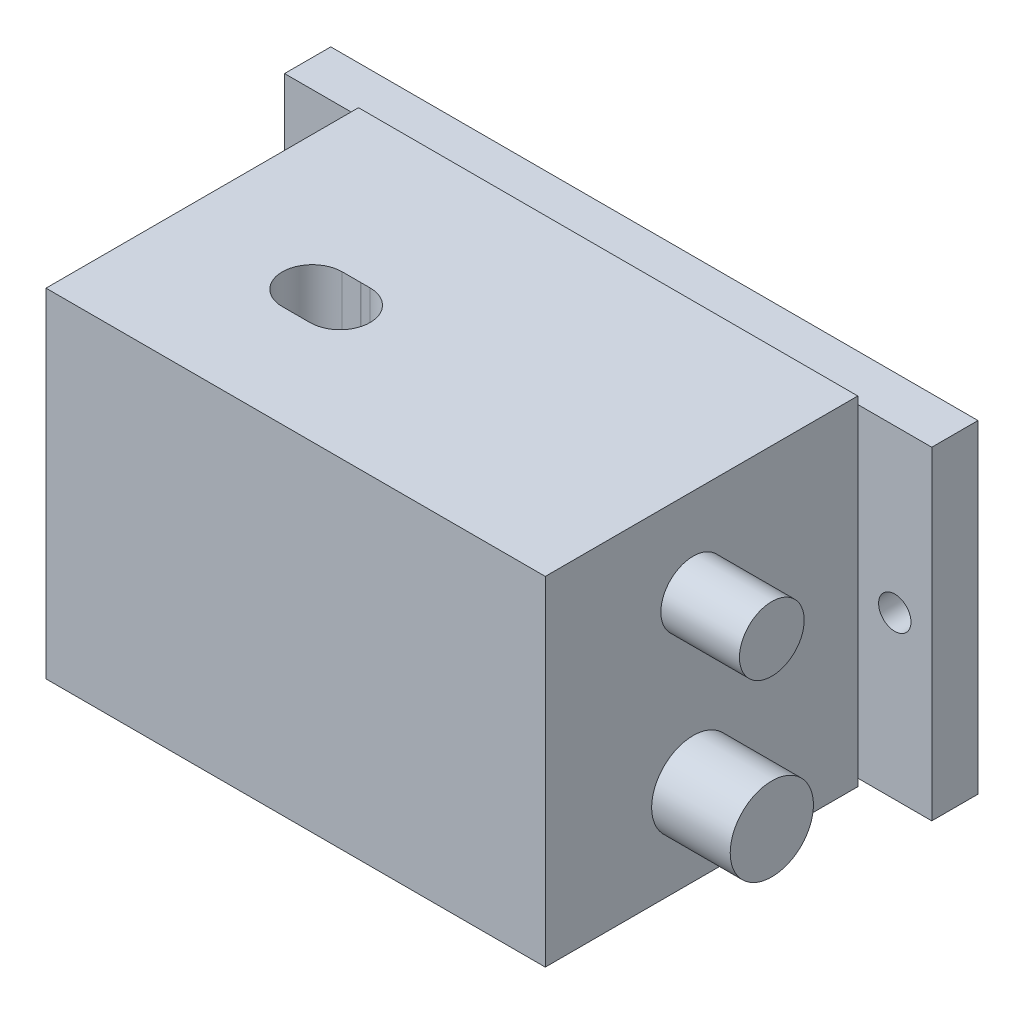
ISO-10303-21;
HEADER;
FILE_DESCRIPTION(('STEP AP214'),'2;1');
FILE_NAME('part.step','',(''),(''),'','','');
FILE_SCHEMA(('AUTOMOTIVE_DESIGN { 1 0 10303 214 1 1 1 1 }'));
ENDSEC;
DATA;
#1=APPLICATION_CONTEXT('core data for automotive mechanical design processes');
#2=APPLICATION_PROTOCOL_DEFINITION('international standard','automotive_design',2000,#1);
#3=PRODUCT_CONTEXT('',#1,'mechanical');
#4=PRODUCT('Part','Part','',(#3));
#5=PRODUCT_RELATED_PRODUCT_CATEGORY('part','',(#4));
#6=PRODUCT_DEFINITION_FORMATION('','',#4);
#7=PRODUCT_DEFINITION_CONTEXT('part definition',#1,'design');
#8=PRODUCT_DEFINITION('design','',#6,#7);
#9=PRODUCT_DEFINITION_SHAPE('','',#8);
#10=(LENGTH_UNIT() NAMED_UNIT(*) SI_UNIT(.MILLI.,.METRE.));
#11=(NAMED_UNIT(*) PLANE_ANGLE_UNIT() SI_UNIT($,.RADIAN.));
#12=(NAMED_UNIT(*) SI_UNIT($,.STERADIAN.) SOLID_ANGLE_UNIT());
#13=UNCERTAINTY_MEASURE_WITH_UNIT(LENGTH_MEASURE(1.E-05),#10,'distance_accuracy_value','');
#14=(GEOMETRIC_REPRESENTATION_CONTEXT(3) GLOBAL_UNCERTAINTY_ASSIGNED_CONTEXT((#13)) GLOBAL_UNIT_ASSIGNED_CONTEXT((#10,
#11,#12)) REPRESENTATION_CONTEXT('',''));
#15=CARTESIAN_POINT('',(0.,0.,0.));
#16=DIRECTION('',(0.,0.,1.));
#17=DIRECTION('',(1.,0.,0.));
#18=AXIS2_PLACEMENT_3D('',#15,#16,#17);
#19=CARTESIAN_POINT('',(27.,8.7,22.8));
#20=DIRECTION('',(1.,0.,0.));
#21=DIRECTION('',(0.,1.,0.));
#22=AXIS2_PLACEMENT_3D('',#19,#20,#21);
#23=CYLINDRICAL_SURFACE('',#22,3.5);
#24=CARTESIAN_POINT('',(35.5,8.7,22.8));
#25=DIRECTION('',(-1.,0.,0.));
#26=DIRECTION('',(0.,0.,1.));
#27=AXIS2_PLACEMENT_3D('',#24,#25,#26);
#28=CIRCLE('',#27,3.5);
#29=CARTESIAN_POINT('',(35.5,8.7,26.3));
#30=VERTEX_POINT('',#29);
#31=EDGE_CURVE('E10',#30,#30,#28,.T.);
#32=ORIENTED_EDGE('',*,*,#31,.T.);
#33=EDGE_LOOP('',(#32));
#34=FACE_BOUND('',#33,.T.);
#35=CARTESIAN_POINT('',(27.,8.7,22.8));
#36=DIRECTION('',(-1.,0.,0.));
#37=DIRECTION('',(0.,0.,1.));
#38=AXIS2_PLACEMENT_3D('',#35,#36,#37);
#39=CIRCLE('',#38,3.5);
#40=CARTESIAN_POINT('',(27.,8.7,26.3));
#41=VERTEX_POINT('',#40);
#42=EDGE_CURVE('E329',#41,#41,#39,.T.);
#43=ORIENTED_EDGE('',*,*,#42,.F.);
#44=EDGE_LOOP('',(#43));
#45=FACE_BOUND('',#44,.T.);
#46=ADVANCED_FACE('F16',(#34,#45),#23,.T.);
#47=CARTESIAN_POINT('',(35.5,8.7,22.4818181818182));
#48=DIRECTION('',(1.,0.,0.));
#49=DIRECTION('',(0.,1.,0.));
#50=AXIS2_PLACEMENT_3D('',#47,#48,#49);
#51=PLANE('',#50);
#52=ORIENTED_EDGE('',*,*,#31,.F.);
#53=EDGE_LOOP('',(#52));
#54=FACE_BOUND('',#53,.T.);
#55=ADVANCED_FACE('F214',(#54),#51,.T.);
#56=CARTESIAN_POINT('',(27.,-9.1,22.8));
#57=DIRECTION('',(1.,0.,0.));
#58=DIRECTION('',(0.,1.,0.));
#59=AXIS2_PLACEMENT_3D('',#56,#57,#58);
#60=CYLINDRICAL_SURFACE('',#59,4.5);
#61=CARTESIAN_POINT('',(35.5,-9.1,22.8));
#62=DIRECTION('',(-1.,0.,0.));
#63=DIRECTION('',(0.,0.,1.));
#64=AXIS2_PLACEMENT_3D('',#61,#62,#63);
#65=CIRCLE('',#64,4.5);
#66=CARTESIAN_POINT('',(35.5,-9.1,27.3));
#67=VERTEX_POINT('',#66);
#68=EDGE_CURVE('E26',#67,#67,#65,.T.);
#69=ORIENTED_EDGE('',*,*,#68,.T.);
#70=EDGE_LOOP('',(#69));
#71=FACE_BOUND('',#70,.T.);
#72=CARTESIAN_POINT('',(27.,-9.1,22.8));
#73=DIRECTION('',(-1.,0.,0.));
#74=DIRECTION('',(0.,0.,1.));
#75=AXIS2_PLACEMENT_3D('',#72,#73,#74);
#76=CIRCLE('',#75,4.5);
#77=CARTESIAN_POINT('',(27.,-9.1,27.3));
#78=VERTEX_POINT('',#77);
#79=EDGE_CURVE('E332',#78,#78,#76,.T.);
#80=ORIENTED_EDGE('',*,*,#79,.F.);
#81=EDGE_LOOP('',(#80));
#82=FACE_BOUND('',#81,.T.);
#83=ADVANCED_FACE('F220',(#71,#82),#60,.T.);
#84=CARTESIAN_POINT('',(35.5,-9.1,22.3909090909091));
#85=DIRECTION('',(1.,0.,0.));
#86=DIRECTION('',(0.,0.,-1.));
#87=AXIS2_PLACEMENT_3D('',#84,#85,#86);
#88=PLANE('',#87);
#89=ORIENTED_EDGE('',*,*,#68,.F.);
#90=EDGE_LOOP('',(#89));
#91=FACE_BOUND('',#90,.T.);
#92=ADVANCED_FACE('F550',(#91),#88,.T.);
#93=CARTESIAN_POINT('',(-11.0000000000244,8.3,24.5000085617076));
#94=DIRECTION('',(0.,1.,0.));
#95=DIRECTION('',(0.,0.,1.));
#96=AXIS2_PLACEMENT_3D('',#93,#94,#95);
#97=PLANE('',#96);
#98=CARTESIAN_POINT('',(-10.5,8.3,24.5));
#99=DIRECTION('',(0.,1.,0.));
#100=DIRECTION('',(1.,0.,0.));
#101=AXIS2_PLACEMENT_3D('',#98,#99,#100);
#102=CIRCLE('',#101,3.25);
#103=CARTESIAN_POINT('',(-10.5,8.3,27.75));
#104=VERTEX_POINT('',#103);
#105=CARTESIAN_POINT('',(-10.489450028215,8.3,21.2500171234151));
#106=VERTEX_POINT('',#105);
#107=EDGE_CURVE('E35',#104,#106,#102,.T.);
#108=ORIENTED_EDGE('',*,*,#107,.F.);
#109=DIRECTION('',(1.,0.,0.));
#110=VECTOR('',#109,1.);
#111=CARTESIAN_POINT('',(-12.5,8.3,27.75));
#112=LINE('',#111,#110);
#113=CARTESIAN_POINT('',(-9.48945002826395,8.3,27.75));
#114=VERTEX_POINT('',#113);
#115=EDGE_CURVE('E255',#104,#114,#112,.T.);
#116=ORIENTED_EDGE('',*,*,#115,.T.);
#117=CARTESIAN_POINT('',(-9.50000000004887,8.3,24.5000171234152));
#118=DIRECTION('',(0.,1.,0.));
#119=DIRECTION('',(1.,0.,0.));
#120=AXIS2_PLACEMENT_3D('',#117,#118,#119);
#121=CIRCLE('',#120,3.25);
#122=CARTESIAN_POINT('',(-9.50000000004887,8.3,21.2500171234151));
#123=VERTEX_POINT('',#122);
#124=EDGE_CURVE('E249',#114,#123,#121,.T.);
#125=ORIENTED_EDGE('',*,*,#124,.T.);
#126=DIRECTION('',(-1.,0.,0.));
#127=VECTOR('',#126,1.);
#128=CARTESIAN_POINT('',(-9.50000000004887,8.3,21.2500171234151));
#129=LINE('',#128,#127);
#130=EDGE_CURVE('E256',#123,#106,#129,.T.);
#131=ORIENTED_EDGE('',*,*,#130,.T.);
#132=EDGE_LOOP('',(#108,#116,#125,#131));
#133=FACE_BOUND('',#132,.T.);
#134=ADVANCED_FACE('F259',(#133),#97,.T.);
#135=CARTESIAN_POINT('',(-12.489450028215,18.3,21.2500171234151));
#136=DIRECTION('',(0.,0.,-1.));
#137=DIRECTION('',(-1.,0.,0.));
#138=AXIS2_PLACEMENT_3D('',#135,#136,#137);
#139=PLANE('',#138);
#140=DIRECTION('',(0.,-1.,0.));
#141=VECTOR('',#140,1.);
#142=CARTESIAN_POINT('',(-10.510549971785,69.7056816347672,21.2500171234151));
#143=LINE('',#142,#141);
#144=CARTESIAN_POINT('',(-10.510549971785,18.3,21.2500171234151));
#145=VERTEX_POINT('',#144);
#146=CARTESIAN_POINT('',(-10.510549971785,8.3,21.2500171234151));
#147=VERTEX_POINT('',#146);
#148=EDGE_CURVE('E286',#145,#147,#143,.T.);
#149=ORIENTED_EDGE('',*,*,#148,.F.);
#150=DIRECTION('',(1.,0.,0.));
#151=VECTOR('',#150,1.);
#152=CARTESIAN_POINT('',(-19.7447250141075,18.3,21.2500171234151));
#153=LINE('',#152,#151);
#154=CARTESIAN_POINT('',(-12.5105499717849,18.3,21.2500171234151));
#155=VERTEX_POINT('',#154);
#156=EDGE_CURVE('E295',#155,#145,#153,.T.);
#157=ORIENTED_EDGE('',*,*,#156,.F.);
#158=DIRECTION('',(0.,-1.,0.));
#159=VECTOR('',#158,1.);
#160=CARTESIAN_POINT('',(-12.5105499717849,18.3,21.2500171234151));
#161=LINE('',#160,#159);
#162=CARTESIAN_POINT('',(-12.5105499717849,8.3,21.2500171234151));
#163=VERTEX_POINT('',#162);
#164=EDGE_CURVE('E264',#155,#163,#161,.T.);
#165=ORIENTED_EDGE('',*,*,#164,.T.);
#166=DIRECTION('',(-1.,0.,0.));
#167=VECTOR('',#166,1.);
#168=CARTESIAN_POINT('',(-9.50000000004887,8.3,21.2500171234151));
#169=LINE('',#168,#167);
#170=EDGE_CURVE('E279',#147,#163,#169,.T.);
#171=ORIENTED_EDGE('',*,*,#170,.F.);
#172=EDGE_LOOP('',(#149,#157,#165,#171));
#173=FACE_BOUND('',#172,.T.);
#174=ADVANCED_FACE('F243',(#173),#139,.F.);
#175=CARTESIAN_POINT('',(-9.5105499718338,18.3,27.75));
#176=DIRECTION('',(0.,0.,1.));
#177=DIRECTION('',(1.,0.,0.));
#178=AXIS2_PLACEMENT_3D('',#175,#176,#177);
#179=PLANE('',#178);
#180=DIRECTION('',(-1.,0.,0.));
#181=VECTOR('',#180,1.);
#182=CARTESIAN_POINT('',(-18.2552749859169,18.3,27.75));
#183=LINE('',#182,#181);
#184=CARTESIAN_POINT('',(-9.48945002826395,18.3,27.75));
#185=VERTEX_POINT('',#184);
#186=CARTESIAN_POINT('',(-12.5,18.3,27.75));
#187=VERTEX_POINT('',#186);
#188=EDGE_CURVE('E263',#185,#187,#183,.T.);
#189=ORIENTED_EDGE('',*,*,#188,.F.);
#190=DIRECTION('',(0.,-1.,0.));
#191=VECTOR('',#190,1.);
#192=CARTESIAN_POINT('',(-9.48945002826395,18.3,27.75));
#193=LINE('',#192,#191);
#194=EDGE_CURVE('E251',#185,#114,#193,.T.);
#195=ORIENTED_EDGE('',*,*,#194,.T.);
#196=ORIENTED_EDGE('',*,*,#115,.F.);
#197=DIRECTION('',(1.,0.,0.));
#198=VECTOR('',#197,1.);
#199=CARTESIAN_POINT('',(-12.5,8.3,27.75));
#200=LINE('',#199,#198);
#201=CARTESIAN_POINT('',(-12.5,8.3,27.75));
#202=VERTEX_POINT('',#201);
#203=EDGE_CURVE('E273',#202,#104,#200,.T.);
#204=ORIENTED_EDGE('',*,*,#203,.F.);
#205=DIRECTION('',(0.,-1.,0.));
#206=VECTOR('',#205,1.);
#207=CARTESIAN_POINT('',(-12.5,18.3,27.75));
#208=LINE('',#207,#206);
#209=EDGE_CURVE('E268',#187,#202,#208,.T.);
#210=ORIENTED_EDGE('',*,*,#209,.F.);
#211=EDGE_LOOP('',(#189,#195,#196,#204,#210));
#212=FACE_BOUND('',#211,.T.);
#213=ADVANCED_FACE('F235',(#212),#179,.F.);
#214=CARTESIAN_POINT('',(-9.50000000004887,18.3,24.5000171234152));
#215=DIRECTION('',(0.,-1.,0.));
#216=DIRECTION('',(0.,0.,-1.));
#217=AXIS2_PLACEMENT_3D('',#214,#215,#216);
#218=CYLINDRICAL_SURFACE('',#217,3.25);
#219=ORIENTED_EDGE('',*,*,#124,.F.);
#220=ORIENTED_EDGE('',*,*,#194,.F.);
#221=CARTESIAN_POINT('',(-9.50000000004887,18.3,24.5000171234152));
#222=DIRECTION('',(0.,-1.,0.));
#223=DIRECTION('',(0.,0.,-1.));
#224=AXIS2_PLACEMENT_3D('',#221,#222,#223);
#225=CIRCLE('',#224,3.25);
#226=CARTESIAN_POINT('',(-9.50000000004887,18.3,21.2500171234151));
#227=VERTEX_POINT('',#226);
#228=EDGE_CURVE('E280',#227,#185,#225,.T.);
#229=ORIENTED_EDGE('',*,*,#228,.F.);
#230=DIRECTION('',(0.,-1.,0.));
#231=VECTOR('',#230,1.);
#232=CARTESIAN_POINT('',(-9.50000000004887,18.3,21.2500171234151));
#233=LINE('',#232,#231);
#234=EDGE_CURVE('E254',#227,#123,#233,.T.);
#235=ORIENTED_EDGE('',*,*,#234,.T.);
#236=EDGE_LOOP('',(#219,#220,#229,#235));
#237=FACE_BOUND('',#236,.T.);
#238=ADVANCED_FACE('F233',(#237),#218,.F.);
#239=CARTESIAN_POINT('',(-12.489450028215,18.3,21.2500171234151));
#240=DIRECTION('',(0.,0.,-1.));
#241=DIRECTION('',(-1.,0.,0.));
#242=AXIS2_PLACEMENT_3D('',#239,#240,#241);
#243=PLANE('',#242);
#244=DIRECTION('',(0.,1.,0.));
#245=VECTOR('',#244,1.);
#246=CARTESIAN_POINT('',(-10.489450028215,69.7056816347672,21.2500171234151));
#247=LINE('',#246,#245);
#248=CARTESIAN_POINT('',(-10.489450028215,18.3,21.2500171234151));
#249=VERTEX_POINT('',#248);
#250=EDGE_CURVE('E283',#106,#249,#247,.T.);
#251=ORIENTED_EDGE('',*,*,#250,.F.);
#252=ORIENTED_EDGE('',*,*,#130,.F.);
#253=ORIENTED_EDGE('',*,*,#234,.F.);
#254=DIRECTION('',(1.,0.,0.));
#255=VECTOR('',#254,1.);
#256=CARTESIAN_POINT('',(-19.7447250141075,18.3,21.2500171234151));
#257=LINE('',#256,#255);
#258=EDGE_CURVE('E281',#249,#227,#257,.T.);
#259=ORIENTED_EDGE('',*,*,#258,.F.);
#260=EDGE_LOOP('',(#251,#252,#253,#259));
#261=FACE_BOUND('',#260,.T.);
#262=ADVANCED_FACE('F231',(#261),#243,.F.);
#263=CARTESIAN_POINT('',(-12.5,18.3,24.5));
#264=DIRECTION('',(0.,-1.,0.));
#265=DIRECTION('',(0.,0.,-1.));
#266=AXIS2_PLACEMENT_3D('',#263,#264,#265);
#267=CYLINDRICAL_SURFACE('',#266,3.25);
#268=CARTESIAN_POINT('',(-12.5,8.3,24.5));
#269=DIRECTION('',(0.,1.,0.));
#270=DIRECTION('',(1.,0.,0.));
#271=AXIS2_PLACEMENT_3D('',#268,#269,#270);
#272=CIRCLE('',#271,3.25);
#273=EDGE_CURVE('E275',#163,#202,#272,.T.);
#274=ORIENTED_EDGE('',*,*,#273,.F.);
#275=ORIENTED_EDGE('',*,*,#164,.F.);
#276=CARTESIAN_POINT('',(-12.5,18.3,24.5));
#277=DIRECTION('',(0.,-1.,0.));
#278=DIRECTION('',(0.,0.,-1.));
#279=AXIS2_PLACEMENT_3D('',#276,#277,#278);
#280=CIRCLE('',#279,3.25);
#281=EDGE_CURVE('E292',#187,#155,#280,.T.);
#282=ORIENTED_EDGE('',*,*,#281,.F.);
#283=ORIENTED_EDGE('',*,*,#209,.T.);
#284=EDGE_LOOP('',(#274,#275,#282,#283));
#285=FACE_BOUND('',#284,.T.);
#286=ADVANCED_FACE('F227',(#285),#267,.F.);
#287=CARTESIAN_POINT('',(-11.0000000000244,8.3,24.5000085617076));
#288=DIRECTION('',(0.,1.,0.));
#289=DIRECTION('',(0.,0.,1.));
#290=AXIS2_PLACEMENT_3D('',#287,#288,#289);
#291=PLANE('',#290);
#292=CARTESIAN_POINT('',(-10.5,8.3,24.5));
#293=DIRECTION('',(0.,1.,0.));
#294=DIRECTION('',(1.,0.,0.));
#295=AXIS2_PLACEMENT_3D('',#292,#293,#294);
#296=CIRCLE('',#295,3.25);
#297=EDGE_CURVE('E296',#147,#104,#296,.T.);
#298=ORIENTED_EDGE('',*,*,#297,.F.);
#299=ORIENTED_EDGE('',*,*,#170,.T.);
#300=ORIENTED_EDGE('',*,*,#273,.T.);
#301=ORIENTED_EDGE('',*,*,#203,.T.);
#302=EDGE_LOOP('',(#298,#299,#300,#301));
#303=FACE_BOUND('',#302,.T.);
#304=ADVANCED_FACE('F230',(#303),#291,.T.);
#305=CARTESIAN_POINT('',(-27.,18.3,5.));
#306=DIRECTION('',(0.,1.,0.));
#307=DIRECTION('',(0.,0.,1.));
#308=AXIS2_PLACEMENT_3D('',#305,#306,#307);
#309=PLANE('',#308);
#310=DIRECTION('',(1.,0.,0.));
#311=VECTOR('',#310,1.);
#312=CARTESIAN_POINT('',(-27.,18.3,38.8));
#313=LINE('',#312,#311);
#314=CARTESIAN_POINT('',(-27.,18.3,38.8));
#315=VERTEX_POINT('',#314);
#316=CARTESIAN_POINT('',(27.,18.3,38.8));
#317=VERTEX_POINT('',#316);
#318=EDGE_CURVE('E276',#315,#317,#313,.T.);
#319=ORIENTED_EDGE('',*,*,#318,.T.);
#320=DIRECTION('',(0.,0.,1.));
#321=VECTOR('',#320,1.);
#322=CARTESIAN_POINT('',(27.,18.3,5.));
#323=LINE('',#322,#321);
#324=CARTESIAN_POINT('',(27.,18.3,5.));
#325=VERTEX_POINT('',#324);
#326=EDGE_CURVE('E300',#325,#317,#323,.T.);
#327=ORIENTED_EDGE('',*,*,#326,.F.);
#328=DIRECTION('',(1.,0.,0.));
#329=VECTOR('',#328,1.);
#330=CARTESIAN_POINT('',(-27.,18.3,5.));
#331=LINE('',#330,#329);
#332=CARTESIAN_POINT('',(-27.,18.3,5.));
#333=VERTEX_POINT('',#332);
#334=EDGE_CURVE('E304',#333,#325,#331,.T.);
#335=ORIENTED_EDGE('',*,*,#334,.F.);
#336=DIRECTION('',(0.,0.,1.));
#337=VECTOR('',#336,1.);
#338=CARTESIAN_POINT('',(-27.,18.3,5.));
#339=LINE('',#338,#337);
#340=EDGE_CURVE('E289',#333,#315,#339,.T.);
#341=ORIENTED_EDGE('',*,*,#340,.T.);
#342=EDGE_LOOP('',(#319,#327,#335,#341));
#343=FACE_BOUND('',#342,.T.);
#344=ORIENTED_EDGE('',*,*,#258,.T.);
#345=ORIENTED_EDGE('',*,*,#228,.T.);
#346=ORIENTED_EDGE('',*,*,#188,.T.);
#347=ORIENTED_EDGE('',*,*,#281,.T.);
#348=ORIENTED_EDGE('',*,*,#156,.T.);
#349=CARTESIAN_POINT('',(-10.5,18.3,24.5));
#350=DIRECTION('',(0.,-1.,0.));
#351=DIRECTION('',(0.,0.,-1.));
#352=AXIS2_PLACEMENT_3D('',#349,#350,#351);
#353=CIRCLE('',#352,3.25);
#354=EDGE_CURVE('E285',#145,#249,#353,.T.);
#355=ORIENTED_EDGE('',*,*,#354,.T.);
#356=EDGE_LOOP('',(#344,#345,#346,#347,#348,#355));
#357=FACE_BOUND('',#356,.T.);
#358=ADVANCED_FACE('F354',(#343,#357),#309,.T.);
#359=CARTESIAN_POINT('',(-10.5,69.7056816347672,24.5));
#360=DIRECTION('',(0.,-1.,0.));
#361=DIRECTION('',(0.,0.,-1.));
#362=AXIS2_PLACEMENT_3D('',#359,#360,#361);
#363=CYLINDRICAL_SURFACE('',#362,3.25);
#364=ORIENTED_EDGE('',*,*,#250,.T.);
#365=ORIENTED_EDGE('',*,*,#354,.F.);
#366=ORIENTED_EDGE('',*,*,#148,.T.);
#367=ORIENTED_EDGE('',*,*,#297,.T.);
#368=ORIENTED_EDGE('',*,*,#107,.T.);
#369=EDGE_LOOP('',(#364,#365,#366,#367,#368));
#370=FACE_BOUND('',#369,.T.);
#371=CARTESIAN_POINT('',(-10.5,-18.3,24.5));
#372=DIRECTION('',(0.,1.,0.));
#373=DIRECTION('',(1.,0.,0.));
#374=AXIS2_PLACEMENT_3D('',#371,#372,#373);
#375=CIRCLE('',#374,3.25);
#376=CARTESIAN_POINT('',(-7.24999999999999,-18.3,24.5));
#377=VERTEX_POINT('',#376);
#378=EDGE_CURVE('E303',#377,#377,#375,.T.);
#379=ORIENTED_EDGE('',*,*,#378,.F.);
#380=EDGE_LOOP('',(#379));
#381=FACE_BOUND('',#380,.T.);
#382=ADVANCED_FACE('F484',(#370,#381),#363,.F.);
#383=CARTESIAN_POINT('',(0.,0.,5.));
#384=DIRECTION('',(0.,0.,1.));
#385=DIRECTION('',(1.,0.,0.));
#386=AXIS2_PLACEMENT_3D('',#383,#384,#385);
#387=PLANE('',#386);
#388=DIRECTION('',(-1.,0.,0.));
#389=VECTOR('',#388,1.);
#390=CARTESIAN_POINT('',(35.,-17.5,5.));
#391=LINE('',#390,#389);
#392=CARTESIAN_POINT('',(27.,-17.5,5.));
#393=VERTEX_POINT('',#392);
#394=CARTESIAN_POINT('',(-27.,-17.5,5.));
#395=VERTEX_POINT('',#394);
#396=EDGE_CURVE('E180',#393,#395,#391,.T.);
#397=ORIENTED_EDGE('',*,*,#396,.F.);
#398=DIRECTION('',(0.,-1.,0.));
#399=VECTOR('',#398,1.);
#400=CARTESIAN_POINT('',(27.,18.3,5.));
#401=LINE('',#400,#399);
#402=CARTESIAN_POINT('',(27.,-18.3,5.));
#403=VERTEX_POINT('',#402);
#404=EDGE_CURVE('E316',#393,#403,#401,.T.);
#405=ORIENTED_EDGE('',*,*,#404,.T.);
#406=DIRECTION('',(-1.,0.,0.));
#407=VECTOR('',#406,1.);
#408=CARTESIAN_POINT('',(27.,-18.3,5.));
#409=LINE('',#408,#407);
#410=CARTESIAN_POINT('',(-27.,-18.3,5.));
#411=VERTEX_POINT('',#410);
#412=EDGE_CURVE('E319',#403,#411,#409,.T.);
#413=ORIENTED_EDGE('',*,*,#412,.T.);
#414=DIRECTION('',(0.,1.,0.));
#415=VECTOR('',#414,1.);
#416=CARTESIAN_POINT('',(-27.,-18.3,5.));
#417=LINE('',#416,#415);
#418=EDGE_CURVE('E322',#411,#395,#417,.T.);
#419=ORIENTED_EDGE('',*,*,#418,.T.);
#420=EDGE_LOOP('',(#397,#405,#413,#419));
#421=FACE_BOUND('',#420,.T.);
#422=ADVANCED_FACE('F373',(#421),#387,.F.);
#423=CARTESIAN_POINT('',(0.,0.,5.));
#424=DIRECTION('',(0.,0.,1.));
#425=DIRECTION('',(1.,0.,0.));
#426=AXIS2_PLACEMENT_3D('',#423,#424,#425);
#427=PLANE('',#426);
#428=DIRECTION('',(1.,0.,0.));
#429=VECTOR('',#428,1.);
#430=CARTESIAN_POINT('',(-35.,17.5,5.));
#431=LINE('',#430,#429);
#432=CARTESIAN_POINT('',(-27.,17.5,5.));
#433=VERTEX_POINT('',#432);
#434=CARTESIAN_POINT('',(27.,17.5,5.));
#435=VERTEX_POINT('',#434);
#436=EDGE_CURVE('E170',#433,#435,#431,.T.);
#437=ORIENTED_EDGE('',*,*,#436,.F.);
#438=DIRECTION('',(0.,1.,0.));
#439=VECTOR('',#438,1.);
#440=CARTESIAN_POINT('',(-27.,-18.3,5.));
#441=LINE('',#440,#439);
#442=EDGE_CURVE('E307',#433,#333,#441,.T.);
#443=ORIENTED_EDGE('',*,*,#442,.T.);
#444=ORIENTED_EDGE('',*,*,#334,.T.);
#445=DIRECTION('',(0.,-1.,0.));
#446=VECTOR('',#445,1.);
#447=CARTESIAN_POINT('',(27.,18.3,5.));
#448=LINE('',#447,#446);
#449=EDGE_CURVE('E308',#325,#435,#448,.T.);
#450=ORIENTED_EDGE('',*,*,#449,.T.);
#451=EDGE_LOOP('',(#437,#443,#444,#450));
#452=FACE_BOUND('',#451,.T.);
#453=ADVANCED_FACE('F358',(#452),#427,.F.);
#454=CARTESIAN_POINT('',(27.,18.3,5.));
#455=DIRECTION('',(1.,0.,0.));
#456=DIRECTION('',(0.,0.,-1.));
#457=AXIS2_PLACEMENT_3D('',#454,#455,#456);
#458=PLANE('',#457);
#459=ORIENTED_EDGE('',*,*,#42,.T.);
#460=EDGE_LOOP('',(#459));
#461=FACE_BOUND('',#460,.T.);
#462=ORIENTED_EDGE('',*,*,#79,.T.);
#463=EDGE_LOOP('',(#462));
#464=FACE_BOUND('',#463,.T.);
#465=DIRECTION('',(0.,-1.,0.));
#466=VECTOR('',#465,1.);
#467=CARTESIAN_POINT('',(27.,18.3,38.8));
#468=LINE('',#467,#466);
#469=CARTESIAN_POINT('',(27.,-18.3,38.8));
#470=VERTEX_POINT('',#469);
#471=EDGE_CURVE('E302',#317,#470,#468,.T.);
#472=ORIENTED_EDGE('',*,*,#471,.T.);
#473=DIRECTION('',(0.,0.,1.));
#474=VECTOR('',#473,1.);
#475=CARTESIAN_POINT('',(27.,-18.3,5.));
#476=LINE('',#475,#474);
#477=EDGE_CURVE('E333',#403,#470,#476,.T.);
#478=ORIENTED_EDGE('',*,*,#477,.F.);
#479=ORIENTED_EDGE('',*,*,#404,.F.);
#480=DIRECTION('',(0.,-1.,0.));
#481=VECTOR('',#480,1.);
#482=CARTESIAN_POINT('',(27.,9.15,5.));
#483=LINE('',#482,#481);
#484=EDGE_CURVE('E184',#435,#393,#483,.T.);
#485=ORIENTED_EDGE('',*,*,#484,.F.);
#486=ORIENTED_EDGE('',*,*,#449,.F.);
#487=ORIENTED_EDGE('',*,*,#326,.T.);
#488=EDGE_LOOP('',(#472,#478,#479,#485,#486,#487));
#489=FACE_BOUND('',#488,.T.);
#490=ADVANCED_FACE('F362',(#461,#464,#489),#458,.T.);
#491=CARTESIAN_POINT('',(27.,-18.3,5.));
#492=DIRECTION('',(0.,-1.,0.));
#493=DIRECTION('',(1.,0.,0.));
#494=AXIS2_PLACEMENT_3D('',#491,#492,#493);
#495=PLANE('',#494);
#496=ORIENTED_EDGE('',*,*,#378,.T.);
#497=EDGE_LOOP('',(#496));
#498=FACE_BOUND('',#497,.T.);
#499=DIRECTION('',(-1.,0.,0.));
#500=VECTOR('',#499,1.);
#501=CARTESIAN_POINT('',(27.,-18.3,38.8));
#502=LINE('',#501,#500);
#503=CARTESIAN_POINT('',(-27.,-18.3,38.8));
#504=VERTEX_POINT('',#503);
#505=EDGE_CURVE('E314',#470,#504,#502,.T.);
#506=ORIENTED_EDGE('',*,*,#505,.T.);
#507=DIRECTION('',(0.,0.,1.));
#508=VECTOR('',#507,1.);
#509=CARTESIAN_POINT('',(-27.,-18.3,5.));
#510=LINE('',#509,#508);
#511=EDGE_CURVE('E340',#411,#504,#510,.T.);
#512=ORIENTED_EDGE('',*,*,#511,.F.);
#513=ORIENTED_EDGE('',*,*,#412,.F.);
#514=ORIENTED_EDGE('',*,*,#477,.T.);
#515=EDGE_LOOP('',(#506,#512,#513,#514));
#516=FACE_BOUND('',#515,.T.);
#517=ADVANCED_FACE('F375',(#498,#516),#495,.T.);
#518=CARTESIAN_POINT('',(-27.,-18.3,5.));
#519=DIRECTION('',(-1.,0.,0.));
#520=DIRECTION('',(0.,-1.,0.));
#521=AXIS2_PLACEMENT_3D('',#518,#519,#520);
#522=PLANE('',#521);
#523=DIRECTION('',(0.,1.,0.));
#524=VECTOR('',#523,1.);
#525=CARTESIAN_POINT('',(-27.,-18.3,38.8));
#526=LINE('',#525,#524);
#527=EDGE_CURVE('E335',#504,#315,#526,.T.);
#528=ORIENTED_EDGE('',*,*,#527,.T.);
#529=ORIENTED_EDGE('',*,*,#340,.F.);
#530=ORIENTED_EDGE('',*,*,#442,.F.);
#531=DIRECTION('',(0.,1.,0.));
#532=VECTOR('',#531,1.);
#533=CARTESIAN_POINT('',(-27.,-9.15000000000001,5.));
#534=LINE('',#533,#532);
#535=EDGE_CURVE('E174',#395,#433,#534,.T.);
#536=ORIENTED_EDGE('',*,*,#535,.F.);
#537=ORIENTED_EDGE('',*,*,#418,.F.);
#538=ORIENTED_EDGE('',*,*,#511,.T.);
#539=EDGE_LOOP('',(#528,#529,#530,#536,#537,#538));
#540=FACE_BOUND('',#539,.T.);
#541=ADVANCED_FACE('F345',(#540),#522,.T.);
#542=CARTESIAN_POINT('',(0.,0.,38.8));
#543=DIRECTION('',(0.,0.,1.));
#544=DIRECTION('',(1.,0.,0.));
#545=AXIS2_PLACEMENT_3D('',#542,#543,#544);
#546=PLANE('',#545);
#547=ORIENTED_EDGE('',*,*,#471,.F.);
#548=ORIENTED_EDGE('',*,*,#318,.F.);
#549=ORIENTED_EDGE('',*,*,#527,.F.);
#550=ORIENTED_EDGE('',*,*,#505,.F.);
#551=EDGE_LOOP('',(#547,#548,#549,#550));
#552=FACE_BOUND('',#551,.T.);
#553=ADVANCED_FACE('F352',(#552),#546,.T.);
#554=CARTESIAN_POINT('',(0.,0.,5.));
#555=DIRECTION('',(0.,0.,1.));
#556=DIRECTION('',(1.,0.,0.));
#557=AXIS2_PLACEMENT_3D('',#554,#555,#556);
#558=PLANE('',#557);
#559=ORIENTED_EDGE('',*,*,#535,.T.);
#560=DIRECTION('',(1.,0.,0.));
#561=VECTOR('',#560,1.);
#562=CARTESIAN_POINT('',(-35.,17.5,5.));
#563=LINE('',#562,#561);
#564=CARTESIAN_POINT('',(-35.,17.5,5.));
#565=VERTEX_POINT('',#564);
#566=EDGE_CURVE('E168',#565,#433,#563,.T.);
#567=ORIENTED_EDGE('',*,*,#566,.F.);
#568=DIRECTION('',(0.,1.,0.));
#569=VECTOR('',#568,1.);
#570=CARTESIAN_POINT('',(-35.,-17.5,5.));
#571=LINE('',#570,#569);
#572=CARTESIAN_POINT('',(-35.,-17.5,5.));
#573=VERTEX_POINT('',#572);
#574=EDGE_CURVE('E144',#573,#565,#571,.T.);
#575=ORIENTED_EDGE('',*,*,#574,.F.);
#576=DIRECTION('',(-1.,0.,0.));
#577=VECTOR('',#576,1.);
#578=CARTESIAN_POINT('',(35.,-17.5,5.));
#579=LINE('',#578,#577);
#580=EDGE_CURVE('E177',#395,#573,#579,.T.);
#581=ORIENTED_EDGE('',*,*,#580,.F.);
#582=EDGE_LOOP('',(#559,#567,#575,#581));
#583=FACE_BOUND('',#582,.T.);
#584=CARTESIAN_POINT('',(-31.,0.,5.));
#585=DIRECTION('',(0.,0.,-1.));
#586=DIRECTION('',(0.,-1.,0.));
#587=AXIS2_PLACEMENT_3D('',#584,#585,#586);
#588=CIRCLE('',#587,1.75);
#589=CARTESIAN_POINT('',(-31.,-1.75,5.));
#590=VERTEX_POINT('',#589);
#591=EDGE_CURVE('E181',#590,#590,#588,.T.);
#592=ORIENTED_EDGE('',*,*,#591,.T.);
#593=EDGE_LOOP('',(#592));
#594=FACE_BOUND('',#593,.T.);
#595=ADVANCED_FACE('F209',(#583,#594),#558,.T.);
#596=CARTESIAN_POINT('',(0.,0.,5.));
#597=DIRECTION('',(0.,0.,1.));
#598=DIRECTION('',(1.,0.,0.));
#599=AXIS2_PLACEMENT_3D('',#596,#597,#598);
#600=PLANE('',#599);
#601=ORIENTED_EDGE('',*,*,#484,.T.);
#602=DIRECTION('',(-1.,0.,0.));
#603=VECTOR('',#602,1.);
#604=CARTESIAN_POINT('',(35.,-17.5,5.));
#605=LINE('',#604,#603);
#606=CARTESIAN_POINT('',(35.,-17.5,5.));
#607=VERTEX_POINT('',#606);
#608=EDGE_CURVE('E166',#607,#393,#605,.T.);
#609=ORIENTED_EDGE('',*,*,#608,.F.);
#610=DIRECTION('',(0.,-1.,0.));
#611=VECTOR('',#610,1.);
#612=CARTESIAN_POINT('',(35.,17.5,5.));
#613=LINE('',#612,#611);
#614=CARTESIAN_POINT('',(35.,17.5,5.));
#615=VERTEX_POINT('',#614);
#616=EDGE_CURVE('E165',#615,#607,#613,.T.);
#617=ORIENTED_EDGE('',*,*,#616,.F.);
#618=DIRECTION('',(1.,0.,0.));
#619=VECTOR('',#618,1.);
#620=CARTESIAN_POINT('',(-35.,17.5,5.));
#621=LINE('',#620,#619);
#622=EDGE_CURVE('E147',#435,#615,#621,.T.);
#623=ORIENTED_EDGE('',*,*,#622,.F.);
#624=EDGE_LOOP('',(#601,#609,#617,#623));
#625=FACE_BOUND('',#624,.T.);
#626=CARTESIAN_POINT('',(31.,0.,5.));
#627=DIRECTION('',(0.,0.,-1.));
#628=DIRECTION('',(0.,-1.,0.));
#629=AXIS2_PLACEMENT_3D('',#626,#627,#628);
#630=CIRCLE('',#629,1.75);
#631=CARTESIAN_POINT('',(31.,-1.75,5.));
#632=VERTEX_POINT('',#631);
#633=EDGE_CURVE('E189',#632,#632,#630,.T.);
#634=ORIENTED_EDGE('',*,*,#633,.T.);
#635=EDGE_LOOP('',(#634));
#636=FACE_BOUND('',#635,.T.);
#637=ADVANCED_FACE('F200',(#625,#636),#600,.T.);
#638=CARTESIAN_POINT('',(31.,0.,0.));
#639=DIRECTION('',(0.,0.,1.));
#640=DIRECTION('',(1.,0.,0.));
#641=AXIS2_PLACEMENT_3D('',#638,#639,#640);
#642=CYLINDRICAL_SURFACE('',#641,1.75);
#643=ORIENTED_EDGE('',*,*,#633,.F.);
#644=EDGE_LOOP('',(#643));
#645=FACE_BOUND('',#644,.T.);
#646=CARTESIAN_POINT('',(31.,0.,0.));
#647=DIRECTION('',(0.,0.,1.));
#648=DIRECTION('',(1.,0.,0.));
#649=AXIS2_PLACEMENT_3D('',#646,#647,#648);
#650=CIRCLE('',#649,1.75);
#651=CARTESIAN_POINT('',(32.75,0.,0.));
#652=VERTEX_POINT('',#651);
#653=EDGE_CURVE('E148',#652,#652,#650,.T.);
#654=ORIENTED_EDGE('',*,*,#653,.F.);
#655=EDGE_LOOP('',(#654));
#656=FACE_BOUND('',#655,.T.);
#657=ADVANCED_FACE('F18',(#645,#656),#642,.F.);
#658=CARTESIAN_POINT('',(-31.,0.,0.));
#659=DIRECTION('',(0.,0.,1.));
#660=DIRECTION('',(1.,0.,0.));
#661=AXIS2_PLACEMENT_3D('',#658,#659,#660);
#662=CYLINDRICAL_SURFACE('',#661,1.75);
#663=ORIENTED_EDGE('',*,*,#591,.F.);
#664=EDGE_LOOP('',(#663));
#665=FACE_BOUND('',#664,.T.);
#666=CARTESIAN_POINT('',(-31.,0.,0.));
#667=DIRECTION('',(0.,0.,1.));
#668=DIRECTION('',(1.,0.,0.));
#669=AXIS2_PLACEMENT_3D('',#666,#667,#668);
#670=CIRCLE('',#669,1.75);
#671=CARTESIAN_POINT('',(-29.25,0.,0.));
#672=VERTEX_POINT('',#671);
#673=EDGE_CURVE('E154',#672,#672,#670,.T.);
#674=ORIENTED_EDGE('',*,*,#673,.F.);
#675=EDGE_LOOP('',(#674));
#676=FACE_BOUND('',#675,.T.);
#677=ADVANCED_FACE('F199',(#665,#676),#662,.F.);
#678=CARTESIAN_POINT('',(35.,17.5,0.));
#679=DIRECTION('',(1.,0.,0.));
#680=DIRECTION('',(0.,0.,-1.));
#681=AXIS2_PLACEMENT_3D('',#678,#679,#680);
#682=PLANE('',#681);
#683=ORIENTED_EDGE('',*,*,#616,.T.);
#684=DIRECTION('',(0.,0.,1.));
#685=VECTOR('',#684,1.);
#686=CARTESIAN_POINT('',(35.,-17.5,0.));
#687=LINE('',#686,#685);
#688=CARTESIAN_POINT('',(35.,-17.5,0.));
#689=VERTEX_POINT('',#688);
#690=EDGE_CURVE('E163',#689,#607,#687,.T.);
#691=ORIENTED_EDGE('',*,*,#690,.F.);
#692=DIRECTION('',(0.,-1.,0.));
#693=VECTOR('',#692,1.);
#694=CARTESIAN_POINT('',(35.,17.5,0.));
#695=LINE('',#694,#693);
#696=CARTESIAN_POINT('',(35.,17.5,0.));
#697=VERTEX_POINT('',#696);
#698=EDGE_CURVE('E155',#697,#689,#695,.T.);
#699=ORIENTED_EDGE('',*,*,#698,.F.);
#700=DIRECTION('',(0.,0.,1.));
#701=VECTOR('',#700,1.);
#702=CARTESIAN_POINT('',(35.,17.5,0.));
#703=LINE('',#702,#701);
#704=EDGE_CURVE('E153',#697,#615,#703,.T.);
#705=ORIENTED_EDGE('',*,*,#704,.T.);
#706=EDGE_LOOP('',(#683,#691,#699,#705));
#707=FACE_BOUND('',#706,.T.);
#708=ADVANCED_FACE('F207',(#707),#682,.T.);
#709=CARTESIAN_POINT('',(35.,-17.5,0.));
#710=DIRECTION('',(0.,-1.,0.));
#711=DIRECTION('',(1.,0.,0.));
#712=AXIS2_PLACEMENT_3D('',#709,#710,#711);
#713=PLANE('',#712);
#714=ORIENTED_EDGE('',*,*,#608,.T.);
#715=ORIENTED_EDGE('',*,*,#396,.T.);
#716=ORIENTED_EDGE('',*,*,#580,.T.);
#717=DIRECTION('',(0.,0.,1.));
#718=VECTOR('',#717,1.);
#719=CARTESIAN_POINT('',(-35.,-17.5,0.));
#720=LINE('',#719,#718);
#721=CARTESIAN_POINT('',(-35.,-17.5,0.));
#722=VERTEX_POINT('',#721);
#723=EDGE_CURVE('E167',#722,#573,#720,.T.);
#724=ORIENTED_EDGE('',*,*,#723,.F.);
#725=DIRECTION('',(-1.,0.,0.));
#726=VECTOR('',#725,1.);
#727=CARTESIAN_POINT('',(35.,-17.5,0.));
#728=LINE('',#727,#726);
#729=EDGE_CURVE('E130',#689,#722,#728,.T.);
#730=ORIENTED_EDGE('',*,*,#729,.F.);
#731=ORIENTED_EDGE('',*,*,#690,.T.);
#732=EDGE_LOOP('',(#714,#715,#716,#724,#730,#731));
#733=FACE_BOUND('',#732,.T.);
#734=ADVANCED_FACE('F394',(#733),#713,.T.);
#735=CARTESIAN_POINT('',(-35.,-17.5,0.));
#736=DIRECTION('',(-1.,0.,0.));
#737=DIRECTION('',(0.,-1.,0.));
#738=AXIS2_PLACEMENT_3D('',#735,#736,#737);
#739=PLANE('',#738);
#740=ORIENTED_EDGE('',*,*,#574,.T.);
#741=DIRECTION('',(0.,0.,1.));
#742=VECTOR('',#741,1.);
#743=CARTESIAN_POINT('',(-35.,17.5,0.));
#744=LINE('',#743,#742);
#745=CARTESIAN_POINT('',(-35.,17.5,0.));
#746=VERTEX_POINT('',#745);
#747=EDGE_CURVE('E142',#746,#565,#744,.T.);
#748=ORIENTED_EDGE('',*,*,#747,.F.);
#749=DIRECTION('',(0.,1.,0.));
#750=VECTOR('',#749,1.);
#751=CARTESIAN_POINT('',(-35.,-17.5,0.));
#752=LINE('',#751,#750);
#753=EDGE_CURVE('E134',#722,#746,#752,.T.);
#754=ORIENTED_EDGE('',*,*,#753,.F.);
#755=ORIENTED_EDGE('',*,*,#723,.T.);
#756=EDGE_LOOP('',(#740,#748,#754,#755));
#757=FACE_BOUND('',#756,.T.);
#758=ADVANCED_FACE('F143',(#757),#739,.T.);
#759=CARTESIAN_POINT('',(-35.,17.5,0.));
#760=DIRECTION('',(0.,1.,0.));
#761=DIRECTION('',(-1.,0.,0.));
#762=AXIS2_PLACEMENT_3D('',#759,#760,#761);
#763=PLANE('',#762);
#764=ORIENTED_EDGE('',*,*,#566,.T.);
#765=ORIENTED_EDGE('',*,*,#436,.T.);
#766=ORIENTED_EDGE('',*,*,#622,.T.);
#767=ORIENTED_EDGE('',*,*,#704,.F.);
#768=DIRECTION('',(1.,0.,0.));
#769=VECTOR('',#768,1.);
#770=CARTESIAN_POINT('',(-35.,17.5,0.));
#771=LINE('',#770,#769);
#772=EDGE_CURVE('E20',#746,#697,#771,.T.);
#773=ORIENTED_EDGE('',*,*,#772,.F.);
#774=ORIENTED_EDGE('',*,*,#747,.T.);
#775=EDGE_LOOP('',(#764,#765,#766,#767,#773,#774));
#776=FACE_BOUND('',#775,.T.);
#777=ADVANCED_FACE('F151',(#776),#763,.T.);
#778=CARTESIAN_POINT('',(0.,0.,0.));
#779=DIRECTION('',(0.,0.,1.));
#780=DIRECTION('',(1.,0.,0.));
#781=AXIS2_PLACEMENT_3D('',#778,#779,#780);
#782=PLANE('',#781);
#783=ORIENTED_EDGE('',*,*,#653,.T.);
#784=EDGE_LOOP('',(#783));
#785=FACE_BOUND('',#784,.T.);
#786=ORIENTED_EDGE('',*,*,#673,.T.);
#787=EDGE_LOOP('',(#786));
#788=FACE_BOUND('',#787,.T.);
#789=ORIENTED_EDGE('',*,*,#772,.T.);
#790=ORIENTED_EDGE('',*,*,#698,.T.);
#791=ORIENTED_EDGE('',*,*,#729,.T.);
#792=ORIENTED_EDGE('',*,*,#753,.T.);
#793=EDGE_LOOP('',(#789,#790,#791,#792));
#794=FACE_BOUND('',#793,.T.);
#795=ADVANCED_FACE('F136',(#785,#788,#794),#782,.F.);
#796=CLOSED_SHELL('',(#46,#55,#83,#92,#134,#174,#213,#238,#262,#286,#304,#358,#382,#422,#453,
#490,#517,#541,#553,#595,#637,#657,#677,#708,#734,#758,#777,#795));
#797=MANIFOLD_SOLID_BREP('B1',#796);
#798=ADVANCED_BREP_SHAPE_REPRESENTATION('',(#18,#797),#14);
#799=SHAPE_DEFINITION_REPRESENTATION(#9,#798);
ENDSEC;
END-ISO-10303-21;
